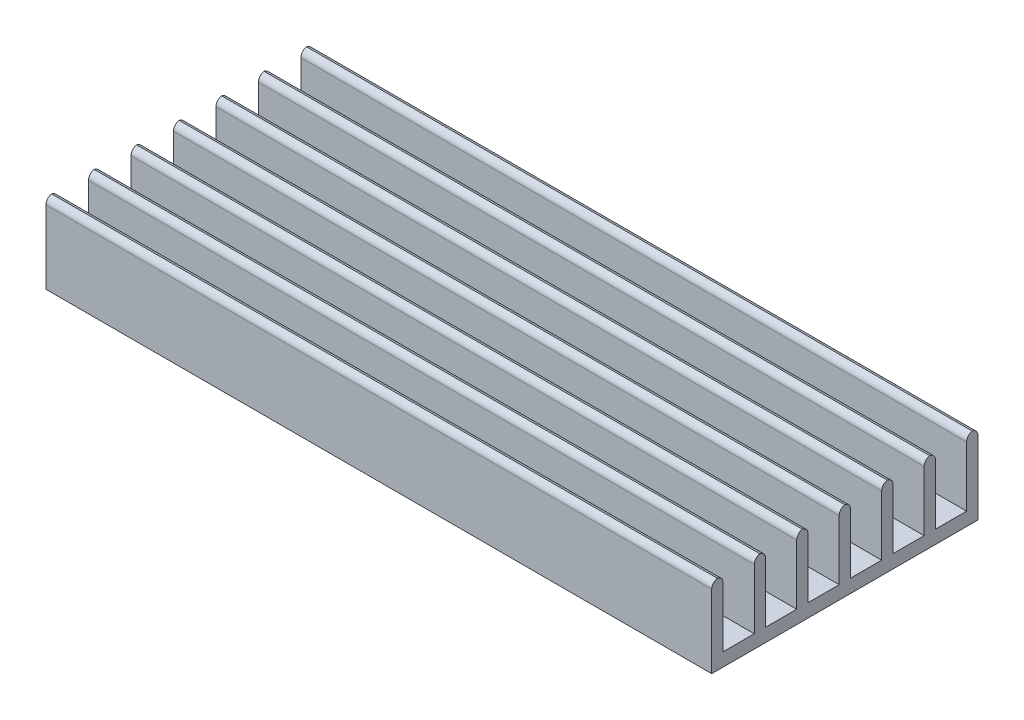
ISO-10303-21;
HEADER;
FILE_DESCRIPTION(('STEP AP214'),'2;1');
FILE_NAME('part.step','',(''),(''),'','','');
FILE_SCHEMA(('AUTOMOTIVE_DESIGN { 1 0 10303 214 1 1 1 1 }'));
ENDSEC;
DATA;
#1=APPLICATION_CONTEXT('core data for automotive mechanical design processes');
#2=APPLICATION_PROTOCOL_DEFINITION('international standard','automotive_design',2000,#1);
#3=PRODUCT_CONTEXT('',#1,'mechanical');
#4=PRODUCT('Part','Part','',(#3));
#5=PRODUCT_RELATED_PRODUCT_CATEGORY('part','',(#4));
#6=PRODUCT_DEFINITION_FORMATION('','',#4);
#7=PRODUCT_DEFINITION_CONTEXT('part definition',#1,'design');
#8=PRODUCT_DEFINITION('design','',#6,#7);
#9=PRODUCT_DEFINITION_SHAPE('','',#8);
#10=(LENGTH_UNIT() NAMED_UNIT(*) SI_UNIT(.MILLI.,.METRE.));
#11=(NAMED_UNIT(*) PLANE_ANGLE_UNIT() SI_UNIT($,.RADIAN.));
#12=(NAMED_UNIT(*) SI_UNIT($,.STERADIAN.) SOLID_ANGLE_UNIT());
#13=UNCERTAINTY_MEASURE_WITH_UNIT(LENGTH_MEASURE(1.E-05),#10,'distance_accuracy_value','');
#14=(GEOMETRIC_REPRESENTATION_CONTEXT(3) GLOBAL_UNCERTAINTY_ASSIGNED_CONTEXT((#13)) GLOBAL_UNIT_ASSIGNED_CONTEXT((#10,
#11,#12)) REPRESENTATION_CONTEXT('',''));
#15=CARTESIAN_POINT('',(0.,0.,0.));
#16=DIRECTION('',(0.,0.,1.));
#17=DIRECTION('',(1.,0.,0.));
#18=AXIS2_PLACEMENT_3D('',#15,#16,#17);
#19=CARTESIAN_POINT('',(25.,6.,-10.));
#20=DIRECTION('',(-1.,0.,0.));
#21=DIRECTION('',(0.,0.,1.));
#22=AXIS2_PLACEMENT_3D('',#19,#20,#21);
#23=PLANE('',#22);
#24=CARTESIAN_POINT('',(25.,5.5,6.455));
#25=DIRECTION('',(-1.,0.,0.));
#26=DIRECTION('',(0.,0.,1.));
#27=AXIS2_PLACEMENT_3D('',#24,#25,#26);
#28=CIRCLE('',#27,0.5);
#29=CARTESIAN_POINT('',(25.,5.5,5.955));
#30=VERTEX_POINT('',#29);
#31=CARTESIAN_POINT('',(25.,5.99434299833213,6.38));
#32=VERTEX_POINT('',#31);
#33=EDGE_CURVE('E533',#30,#32,#28,.F.);
#34=ORIENTED_EDGE('',*,*,#33,.T.);
#35=CARTESIAN_POINT('',(25.,5.5,6.305));
#36=DIRECTION('',(-1.,0.,0.));
#37=DIRECTION('',(0.,0.,1.));
#38=AXIS2_PLACEMENT_3D('',#35,#36,#37);
#39=CIRCLE('',#38,0.5);
#40=CARTESIAN_POINT('',(25.,5.5,6.805));
#41=VERTEX_POINT('',#40);
#42=EDGE_CURVE('E536',#32,#41,#39,.F.);
#43=ORIENTED_EDGE('',*,*,#42,.T.);
#44=DIRECTION('',(0.,1.,0.));
#45=VECTOR('',#44,1.);
#46=CARTESIAN_POINT('',(25.,1.,6.805));
#47=LINE('',#46,#45);
#48=CARTESIAN_POINT('',(25.,1.,6.805));
#49=VERTEX_POINT('',#48);
#50=EDGE_CURVE('E459',#49,#41,#47,.T.);
#51=ORIENTED_EDGE('',*,*,#50,.F.);
#52=DIRECTION('',(0.,0.,-1.));
#53=VECTOR('',#52,1.);
#54=CARTESIAN_POINT('',(25.,1.,0.));
#55=LINE('',#54,#53);
#56=CARTESIAN_POINT('',(25.,1.,9.145));
#57=VERTEX_POINT('',#56);
#58=EDGE_CURVE('E449',#57,#49,#55,.T.);
#59=ORIENTED_EDGE('',*,*,#58,.F.);
#60=DIRECTION('',(0.,1.,0.));
#61=VECTOR('',#60,1.);
#62=CARTESIAN_POINT('',(25.,1.,9.145));
#63=LINE('',#62,#61);
#64=CARTESIAN_POINT('',(25.,5.5,9.145));
#65=VERTEX_POINT('',#64);
#66=EDGE_CURVE('E463',#57,#65,#63,.T.);
#67=ORIENTED_EDGE('',*,*,#66,.T.);
#68=CARTESIAN_POINT('',(25.,5.5,9.645));
#69=DIRECTION('',(-1.,0.,0.));
#70=DIRECTION('',(0.,0.,1.));
#71=AXIS2_PLACEMENT_3D('',#68,#69,#70);
#72=CIRCLE('',#71,0.5);
#73=CARTESIAN_POINT('',(25.,5.99471582752121,9.5725));
#74=VERTEX_POINT('',#73);
#75=EDGE_CURVE('E506',#65,#74,#72,.F.);
#76=ORIENTED_EDGE('',*,*,#75,.T.);
#77=CARTESIAN_POINT('',(25.,5.5,9.5));
#78=DIRECTION('',(-1.,0.,0.));
#79=DIRECTION('',(0.,0.,1.));
#80=AXIS2_PLACEMENT_3D('',#77,#78,#79);
#81=CIRCLE('',#80,0.5);
#82=CARTESIAN_POINT('',(25.,5.5,10.));
#83=VERTEX_POINT('',#82);
#84=EDGE_CURVE('E503',#74,#83,#81,.F.);
#85=ORIENTED_EDGE('',*,*,#84,.T.);
#86=DIRECTION('',(0.,-1.,0.));
#87=VECTOR('',#86,1.);
#88=CARTESIAN_POINT('',(25.,6.,10.));
#89=LINE('',#88,#87);
#90=CARTESIAN_POINT('',(25.,0.,10.));
#91=VERTEX_POINT('',#90);
#92=EDGE_CURVE('E485',#83,#91,#89,.T.);
#93=ORIENTED_EDGE('',*,*,#92,.T.);
#94=DIRECTION('',(0.,0.,-1.));
#95=VECTOR('',#94,1.);
#96=CARTESIAN_POINT('',(25.,0.,-10.));
#97=LINE('',#96,#95);
#98=CARTESIAN_POINT('',(25.,0.,-10.));
#99=VERTEX_POINT('',#98);
#100=EDGE_CURVE('E310',#91,#99,#97,.T.);
#101=ORIENTED_EDGE('',*,*,#100,.T.);
#102=DIRECTION('',(0.,-1.,0.));
#103=VECTOR('',#102,1.);
#104=CARTESIAN_POINT('',(25.,6.,-10.));
#105=LINE('',#104,#103);
#106=CARTESIAN_POINT('',(25.,5.5,-10.));
#107=VERTEX_POINT('',#106);
#108=EDGE_CURVE('E494',#107,#99,#105,.T.);
#109=ORIENTED_EDGE('',*,*,#108,.F.);
#110=CARTESIAN_POINT('',(25.,5.5,-9.5));
#111=DIRECTION('',(-1.,0.,0.));
#112=DIRECTION('',(0.,0.,1.));
#113=AXIS2_PLACEMENT_3D('',#110,#111,#112);
#114=CIRCLE('',#113,0.5);
#115=CARTESIAN_POINT('',(25.,5.99471582752121,-9.5725));
#116=VERTEX_POINT('',#115);
#117=EDGE_CURVE('E497',#107,#116,#114,.F.);
#118=ORIENTED_EDGE('',*,*,#117,.T.);
#119=CARTESIAN_POINT('',(25.,5.5,-9.645));
#120=DIRECTION('',(-1.,0.,0.));
#121=DIRECTION('',(0.,0.,1.));
#122=AXIS2_PLACEMENT_3D('',#119,#120,#121);
#123=CIRCLE('',#122,0.5);
#124=CARTESIAN_POINT('',(25.,5.5,-9.145));
#125=VERTEX_POINT('',#124);
#126=EDGE_CURVE('E500',#116,#125,#123,.F.);
#127=ORIENTED_EDGE('',*,*,#126,.T.);
#128=DIRECTION('',(0.,1.,0.));
#129=VECTOR('',#128,1.);
#130=CARTESIAN_POINT('',(25.,1.,-9.145));
#131=LINE('',#130,#129);
#132=CARTESIAN_POINT('',(25.,1.,-9.145));
#133=VERTEX_POINT('',#132);
#134=EDGE_CURVE('E307',#133,#125,#131,.T.);
#135=ORIENTED_EDGE('',*,*,#134,.F.);
#136=DIRECTION('',(0.,0.,-1.));
#137=VECTOR('',#136,1.);
#138=CARTESIAN_POINT('',(25.,1.,0.));
#139=LINE('',#138,#137);
#140=CARTESIAN_POINT('',(25.,1.,-6.805));
#141=VERTEX_POINT('',#140);
#142=EDGE_CURVE('E284',#141,#133,#139,.T.);
#143=ORIENTED_EDGE('',*,*,#142,.F.);
#144=DIRECTION('',(0.,1.,0.));
#145=VECTOR('',#144,1.);
#146=CARTESIAN_POINT('',(25.,1.,-6.805));
#147=LINE('',#146,#145);
#148=CARTESIAN_POINT('',(25.,5.5,-6.805));
#149=VERTEX_POINT('',#148);
#150=EDGE_CURVE('E311',#141,#149,#147,.T.);
#151=ORIENTED_EDGE('',*,*,#150,.T.);
#152=CARTESIAN_POINT('',(25.,5.5,-6.305));
#153=DIRECTION('',(-1.,0.,0.));
#154=DIRECTION('',(0.,0.,1.));
#155=AXIS2_PLACEMENT_3D('',#152,#153,#154);
#156=CIRCLE('',#155,0.5);
#157=CARTESIAN_POINT('',(25.,5.99434299833213,-6.38));
#158=VERTEX_POINT('',#157);
#159=EDGE_CURVE('E509',#149,#158,#156,.F.);
#160=ORIENTED_EDGE('',*,*,#159,.T.);
#161=CARTESIAN_POINT('',(25.,5.5,-6.455));
#162=DIRECTION('',(-1.,0.,0.));
#163=DIRECTION('',(0.,0.,1.));
#164=AXIS2_PLACEMENT_3D('',#161,#162,#163);
#165=CIRCLE('',#164,0.5);
#166=CARTESIAN_POINT('',(25.,5.5,-5.955));
#167=VERTEX_POINT('',#166);
#168=EDGE_CURVE('E512',#158,#167,#165,.F.);
#169=ORIENTED_EDGE('',*,*,#168,.T.);
#170=DIRECTION('',(0.,1.,0.));
#171=VECTOR('',#170,1.);
#172=CARTESIAN_POINT('',(25.,1.,-5.955));
#173=LINE('',#172,#171);
#174=CARTESIAN_POINT('',(25.,1.,-5.955));
#175=VERTEX_POINT('',#174);
#176=EDGE_CURVE('E295',#175,#167,#173,.T.);
#177=ORIENTED_EDGE('',*,*,#176,.F.);
#178=DIRECTION('',(0.,0.,-1.));
#179=VECTOR('',#178,1.);
#180=CARTESIAN_POINT('',(25.,1.,0.));
#181=LINE('',#180,#179);
#182=CARTESIAN_POINT('',(25.,1.,-3.615));
#183=VERTEX_POINT('',#182);
#184=EDGE_CURVE('E329',#183,#175,#181,.T.);
#185=ORIENTED_EDGE('',*,*,#184,.F.);
#186=DIRECTION('',(0.,1.,0.));
#187=VECTOR('',#186,1.);
#188=CARTESIAN_POINT('',(25.,1.,-3.615));
#189=LINE('',#188,#187);
#190=CARTESIAN_POINT('',(25.,5.5,-3.615));
#191=VERTEX_POINT('',#190);
#192=EDGE_CURVE('E337',#183,#191,#189,.T.);
#193=ORIENTED_EDGE('',*,*,#192,.T.);
#194=CARTESIAN_POINT('',(25.,5.5,-3.115));
#195=DIRECTION('',(-1.,0.,0.));
#196=DIRECTION('',(0.,0.,1.));
#197=AXIS2_PLACEMENT_3D('',#194,#195,#196);
#198=CIRCLE('',#197,0.5);
#199=CARTESIAN_POINT('',(25.,5.99434299833213,-3.19));
#200=VERTEX_POINT('',#199);
#201=EDGE_CURVE('E515',#191,#200,#198,.F.);
#202=ORIENTED_EDGE('',*,*,#201,.T.);
#203=CARTESIAN_POINT('',(25.,5.5,-3.265));
#204=DIRECTION('',(-1.,0.,0.));
#205=DIRECTION('',(0.,0.,1.));
#206=AXIS2_PLACEMENT_3D('',#203,#204,#205);
#207=CIRCLE('',#206,0.5);
#208=CARTESIAN_POINT('',(25.,5.5,-2.765));
#209=VERTEX_POINT('',#208);
#210=EDGE_CURVE('E518',#200,#209,#207,.F.);
#211=ORIENTED_EDGE('',*,*,#210,.T.);
#212=DIRECTION('',(0.,1.,0.));
#213=VECTOR('',#212,1.);
#214=CARTESIAN_POINT('',(25.,1.,-2.765));
#215=LINE('',#214,#213);
#216=CARTESIAN_POINT('',(25.,1.,-2.765));
#217=VERTEX_POINT('',#216);
#218=EDGE_CURVE('E321',#217,#209,#215,.T.);
#219=ORIENTED_EDGE('',*,*,#218,.F.);
#220=DIRECTION('',(0.,0.,-1.));
#221=VECTOR('',#220,1.);
#222=CARTESIAN_POINT('',(25.,1.,0.));
#223=LINE('',#222,#221);
#224=CARTESIAN_POINT('',(25.,1.,-0.425));
#225=VERTEX_POINT('',#224);
#226=EDGE_CURVE('E360',#225,#217,#223,.T.);
#227=ORIENTED_EDGE('',*,*,#226,.F.);
#228=DIRECTION('',(0.,1.,0.));
#229=VECTOR('',#228,1.);
#230=CARTESIAN_POINT('',(25.,1.,-0.425));
#231=LINE('',#230,#229);
#232=CARTESIAN_POINT('',(25.,5.5,-0.425));
#233=VERTEX_POINT('',#232);
#234=EDGE_CURVE('E368',#225,#233,#231,.T.);
#235=ORIENTED_EDGE('',*,*,#234,.T.);
#236=CARTESIAN_POINT('',(25.,5.5,0.075));
#237=DIRECTION('',(-1.,0.,0.));
#238=DIRECTION('',(0.,0.,1.));
#239=AXIS2_PLACEMENT_3D('',#236,#237,#238);
#240=CIRCLE('',#239,0.5);
#241=CARTESIAN_POINT('',(25.,5.99434299833213,0.));
#242=VERTEX_POINT('',#241);
#243=EDGE_CURVE('E521',#233,#242,#240,.F.);
#244=ORIENTED_EDGE('',*,*,#243,.T.);
#245=CARTESIAN_POINT('',(25.,5.5,-0.075));
#246=DIRECTION('',(-1.,0.,0.));
#247=DIRECTION('',(0.,0.,1.));
#248=AXIS2_PLACEMENT_3D('',#245,#246,#247);
#249=CIRCLE('',#248,0.5);
#250=CARTESIAN_POINT('',(25.,5.5,0.425));
#251=VERTEX_POINT('',#250);
#252=EDGE_CURVE('E524',#242,#251,#249,.F.);
#253=ORIENTED_EDGE('',*,*,#252,.T.);
#254=DIRECTION('',(0.,1.,0.));
#255=VECTOR('',#254,1.);
#256=CARTESIAN_POINT('',(25.,1.,0.425));
#257=LINE('',#256,#255);
#258=CARTESIAN_POINT('',(25.,1.,0.425));
#259=VERTEX_POINT('',#258);
#260=EDGE_CURVE('E399',#259,#251,#257,.T.);
#261=ORIENTED_EDGE('',*,*,#260,.F.);
#262=DIRECTION('',(0.,0.,-1.));
#263=VECTOR('',#262,1.);
#264=CARTESIAN_POINT('',(25.,1.,0.));
#265=LINE('',#264,#263);
#266=CARTESIAN_POINT('',(25.,1.,2.765));
#267=VERTEX_POINT('',#266);
#268=EDGE_CURVE('E388',#267,#259,#265,.T.);
#269=ORIENTED_EDGE('',*,*,#268,.F.);
#270=DIRECTION('',(0.,1.,0.));
#271=VECTOR('',#270,1.);
#272=CARTESIAN_POINT('',(25.,1.,2.765));
#273=LINE('',#272,#271);
#274=CARTESIAN_POINT('',(25.,5.5,2.765));
#275=VERTEX_POINT('',#274);
#276=EDGE_CURVE('E403',#267,#275,#273,.T.);
#277=ORIENTED_EDGE('',*,*,#276,.T.);
#278=CARTESIAN_POINT('',(25.,5.5,3.265));
#279=DIRECTION('',(-1.,0.,0.));
#280=DIRECTION('',(0.,0.,1.));
#281=AXIS2_PLACEMENT_3D('',#278,#279,#280);
#282=CIRCLE('',#281,0.5);
#283=CARTESIAN_POINT('',(25.,5.99434299833213,3.19));
#284=VERTEX_POINT('',#283);
#285=EDGE_CURVE('E527',#275,#284,#282,.F.);
#286=ORIENTED_EDGE('',*,*,#285,.T.);
#287=CARTESIAN_POINT('',(25.,5.5,3.115));
#288=DIRECTION('',(-1.,0.,0.));
#289=DIRECTION('',(0.,0.,1.));
#290=AXIS2_PLACEMENT_3D('',#287,#288,#289);
#291=CIRCLE('',#290,0.5);
#292=CARTESIAN_POINT('',(25.,5.5,3.615));
#293=VERTEX_POINT('',#292);
#294=EDGE_CURVE('E530',#284,#293,#291,.F.);
#295=ORIENTED_EDGE('',*,*,#294,.T.);
#296=DIRECTION('',(0.,1.,0.));
#297=VECTOR('',#296,1.);
#298=CARTESIAN_POINT('',(25.,1.,3.615));
#299=LINE('',#298,#297);
#300=CARTESIAN_POINT('',(25.,1.,3.615));
#301=VERTEX_POINT('',#300);
#302=EDGE_CURVE('E429',#301,#293,#299,.T.);
#303=ORIENTED_EDGE('',*,*,#302,.F.);
#304=DIRECTION('',(0.,0.,-1.));
#305=VECTOR('',#304,1.);
#306=CARTESIAN_POINT('',(25.,1.,0.));
#307=LINE('',#306,#305);
#308=CARTESIAN_POINT('',(25.,1.,5.955));
#309=VERTEX_POINT('',#308);
#310=EDGE_CURVE('E419',#309,#301,#307,.T.);
#311=ORIENTED_EDGE('',*,*,#310,.F.);
#312=DIRECTION('',(0.,1.,0.));
#313=VECTOR('',#312,1.);
#314=CARTESIAN_POINT('',(25.,1.,5.955));
#315=LINE('',#314,#313);
#316=EDGE_CURVE('E433',#309,#30,#315,.T.);
#317=ORIENTED_EDGE('',*,*,#316,.T.);
#318=EDGE_LOOP('',(#34,#43,#51,#59,#67,#76,#85,#93,#101,#109,#118,#127,#135,#143,#151,#160,#169,
#177,#185,#193,#202,#211,#219,#227,#235,#244,#253,#261,#269,#277,#286,#295,#303,#311,#317));
#319=FACE_BOUND('',#318,.T.);
#320=ADVANCED_FACE('F45',(#319),#23,.F.);
#321=CARTESIAN_POINT('',(-25.,6.,-10.));
#322=DIRECTION('',(1.,0.,0.));
#323=DIRECTION('',(0.,0.,-1.));
#324=AXIS2_PLACEMENT_3D('',#321,#322,#323);
#325=PLANE('',#324);
#326=DIRECTION('',(0.,1.,0.));
#327=VECTOR('',#326,1.);
#328=CARTESIAN_POINT('',(-25.,1.,6.805));
#329=LINE('',#328,#327);
#330=CARTESIAN_POINT('',(-25.,1.,6.805));
#331=VERTEX_POINT('',#330);
#332=CARTESIAN_POINT('',(-25.,5.5,6.805));
#333=VERTEX_POINT('',#332);
#334=EDGE_CURVE('E415',#331,#333,#329,.T.);
#335=ORIENTED_EDGE('',*,*,#334,.T.);
#336=CARTESIAN_POINT('',(-25.,5.5,6.305));
#337=DIRECTION('',(1.,0.,0.));
#338=DIRECTION('',(0.,0.,-1.));
#339=AXIS2_PLACEMENT_3D('',#336,#337,#338);
#340=CIRCLE('',#339,0.5);
#341=CARTESIAN_POINT('',(-25.,5.99434299833213,6.38));
#342=VERTEX_POINT('',#341);
#343=EDGE_CURVE('E63',#333,#342,#340,.F.);
#344=ORIENTED_EDGE('',*,*,#343,.T.);
#345=CARTESIAN_POINT('',(-25.,5.5,6.455));
#346=DIRECTION('',(1.,0.,0.));
#347=DIRECTION('',(0.,0.,-1.));
#348=AXIS2_PLACEMENT_3D('',#345,#346,#347);
#349=CIRCLE('',#348,0.5);
#350=CARTESIAN_POINT('',(-25.,5.5,5.955));
#351=VERTEX_POINT('',#350);
#352=EDGE_CURVE('E578',#342,#351,#349,.F.);
#353=ORIENTED_EDGE('',*,*,#352,.T.);
#354=DIRECTION('',(0.,1.,0.));
#355=VECTOR('',#354,1.);
#356=CARTESIAN_POINT('',(-25.,1.,5.955));
#357=LINE('',#356,#355);
#358=CARTESIAN_POINT('',(-25.,1.,5.955));
#359=VERTEX_POINT('',#358);
#360=EDGE_CURVE('E426',#359,#351,#357,.T.);
#361=ORIENTED_EDGE('',*,*,#360,.F.);
#362=DIRECTION('',(0.,0.,1.));
#363=VECTOR('',#362,1.);
#364=CARTESIAN_POINT('',(-25.,1.,0.));
#365=LINE('',#364,#363);
#366=CARTESIAN_POINT('',(-25.,1.,3.615));
#367=VERTEX_POINT('',#366);
#368=EDGE_CURVE('E410',#367,#359,#365,.T.);
#369=ORIENTED_EDGE('',*,*,#368,.F.);
#370=DIRECTION('',(0.,1.,0.));
#371=VECTOR('',#370,1.);
#372=CARTESIAN_POINT('',(-25.,1.,3.615));
#373=LINE('',#372,#371);
#374=CARTESIAN_POINT('',(-25.,5.5,3.615));
#375=VERTEX_POINT('',#374);
#376=EDGE_CURVE('E384',#367,#375,#373,.T.);
#377=ORIENTED_EDGE('',*,*,#376,.T.);
#378=CARTESIAN_POINT('',(-25.,5.5,3.115));
#379=DIRECTION('',(1.,0.,0.));
#380=DIRECTION('',(0.,0.,-1.));
#381=AXIS2_PLACEMENT_3D('',#378,#379,#380);
#382=CIRCLE('',#381,0.5);
#383=CARTESIAN_POINT('',(-25.,5.99434299833213,3.19));
#384=VERTEX_POINT('',#383);
#385=EDGE_CURVE('E70',#375,#384,#382,.F.);
#386=ORIENTED_EDGE('',*,*,#385,.T.);
#387=CARTESIAN_POINT('',(-25.,5.5,3.265));
#388=DIRECTION('',(1.,0.,0.));
#389=DIRECTION('',(0.,0.,-1.));
#390=AXIS2_PLACEMENT_3D('',#387,#388,#389);
#391=CIRCLE('',#390,0.5);
#392=CARTESIAN_POINT('',(-25.,5.5,2.765));
#393=VERTEX_POINT('',#392);
#394=EDGE_CURVE('E573',#384,#393,#391,.F.);
#395=ORIENTED_EDGE('',*,*,#394,.T.);
#396=DIRECTION('',(0.,1.,0.));
#397=VECTOR('',#396,1.);
#398=CARTESIAN_POINT('',(-25.,1.,2.765));
#399=LINE('',#398,#397);
#400=CARTESIAN_POINT('',(-25.,1.,2.765));
#401=VERTEX_POINT('',#400);
#402=EDGE_CURVE('E395',#401,#393,#399,.T.);
#403=ORIENTED_EDGE('',*,*,#402,.F.);
#404=DIRECTION('',(0.,0.,1.));
#405=VECTOR('',#404,1.);
#406=CARTESIAN_POINT('',(-25.,1.,0.));
#407=LINE('',#406,#405);
#408=CARTESIAN_POINT('',(-25.,1.,0.425));
#409=VERTEX_POINT('',#408);
#410=EDGE_CURVE('E379',#409,#401,#407,.T.);
#411=ORIENTED_EDGE('',*,*,#410,.F.);
#412=DIRECTION('',(0.,1.,0.));
#413=VECTOR('',#412,1.);
#414=CARTESIAN_POINT('',(-25.,1.,0.425));
#415=LINE('',#414,#413);
#416=CARTESIAN_POINT('',(-25.,5.5,0.425));
#417=VERTEX_POINT('',#416);
#418=EDGE_CURVE('E352',#409,#417,#415,.T.);
#419=ORIENTED_EDGE('',*,*,#418,.T.);
#420=CARTESIAN_POINT('',(-25.,5.5,-0.075));
#421=DIRECTION('',(1.,0.,0.));
#422=DIRECTION('',(0.,0.,-1.));
#423=AXIS2_PLACEMENT_3D('',#420,#421,#422);
#424=CIRCLE('',#423,0.5);
#425=CARTESIAN_POINT('',(-25.,5.99434299833213,0.));
#426=VERTEX_POINT('',#425);
#427=EDGE_CURVE('E570',#417,#426,#424,.F.);
#428=ORIENTED_EDGE('',*,*,#427,.T.);
#429=CARTESIAN_POINT('',(-25.,5.5,0.075));
#430=DIRECTION('',(1.,0.,0.));
#431=DIRECTION('',(0.,0.,-1.));
#432=AXIS2_PLACEMENT_3D('',#429,#430,#431);
#433=CIRCLE('',#432,0.5);
#434=CARTESIAN_POINT('',(-25.,5.5,-0.425));
#435=VERTEX_POINT('',#434);
#436=EDGE_CURVE('E567',#426,#435,#433,.F.);
#437=ORIENTED_EDGE('',*,*,#436,.T.);
#438=DIRECTION('',(0.,1.,0.));
#439=VECTOR('',#438,1.);
#440=CARTESIAN_POINT('',(-25.,1.,-0.425));
#441=LINE('',#440,#439);
#442=CARTESIAN_POINT('',(-25.,1.,-0.425));
#443=VERTEX_POINT('',#442);
#444=EDGE_CURVE('E372',#443,#435,#441,.T.);
#445=ORIENTED_EDGE('',*,*,#444,.F.);
#446=DIRECTION('',(0.,0.,1.));
#447=VECTOR('',#446,1.);
#448=CARTESIAN_POINT('',(-25.,1.,0.));
#449=LINE('',#448,#447);
#450=CARTESIAN_POINT('',(-25.,1.,-2.765));
#451=VERTEX_POINT('',#450);
#452=EDGE_CURVE('E351',#451,#443,#449,.T.);
#453=ORIENTED_EDGE('',*,*,#452,.F.);
#454=DIRECTION('',(0.,1.,0.));
#455=VECTOR('',#454,1.);
#456=CARTESIAN_POINT('',(-25.,1.,-2.765));
#457=LINE('',#456,#455);
#458=CARTESIAN_POINT('',(-25.,5.5,-2.765));
#459=VERTEX_POINT('',#458);
#460=EDGE_CURVE('E364',#451,#459,#457,.T.);
#461=ORIENTED_EDGE('',*,*,#460,.T.);
#462=CARTESIAN_POINT('',(-25.,5.5,-3.265));
#463=DIRECTION('',(1.,0.,0.));
#464=DIRECTION('',(0.,0.,-1.));
#465=AXIS2_PLACEMENT_3D('',#462,#463,#464);
#466=CIRCLE('',#465,0.5);
#467=CARTESIAN_POINT('',(-25.,5.99434299833213,-3.19));
#468=VERTEX_POINT('',#467);
#469=EDGE_CURVE('E564',#459,#468,#466,.F.);
#470=ORIENTED_EDGE('',*,*,#469,.T.);
#471=CARTESIAN_POINT('',(-25.,5.5,-3.115));
#472=DIRECTION('',(1.,0.,0.));
#473=DIRECTION('',(0.,0.,-1.));
#474=AXIS2_PLACEMENT_3D('',#471,#472,#473);
#475=CIRCLE('',#474,0.5);
#476=CARTESIAN_POINT('',(-25.,5.5,-3.615));
#477=VERTEX_POINT('',#476);
#478=EDGE_CURVE('E561',#468,#477,#475,.F.);
#479=ORIENTED_EDGE('',*,*,#478,.T.);
#480=DIRECTION('',(0.,1.,0.));
#481=VECTOR('',#480,1.);
#482=CARTESIAN_POINT('',(-25.,1.,-3.615));
#483=LINE('',#482,#481);
#484=CARTESIAN_POINT('',(-25.,1.,-3.615));
#485=VERTEX_POINT('',#484);
#486=EDGE_CURVE('E341',#485,#477,#483,.T.);
#487=ORIENTED_EDGE('',*,*,#486,.F.);
#488=DIRECTION('',(0.,0.,1.));
#489=VECTOR('',#488,1.);
#490=CARTESIAN_POINT('',(-25.,1.,0.));
#491=LINE('',#490,#489);
#492=CARTESIAN_POINT('',(-25.,1.,-5.955));
#493=VERTEX_POINT('',#492);
#494=EDGE_CURVE('E320',#493,#485,#491,.T.);
#495=ORIENTED_EDGE('',*,*,#494,.F.);
#496=DIRECTION('',(0.,1.,0.));
#497=VECTOR('',#496,1.);
#498=CARTESIAN_POINT('',(-25.,1.,-5.955));
#499=LINE('',#498,#497);
#500=CARTESIAN_POINT('',(-25.,5.5,-5.955));
#501=VERTEX_POINT('',#500);
#502=EDGE_CURVE('E333',#493,#501,#499,.T.);
#503=ORIENTED_EDGE('',*,*,#502,.T.);
#504=CARTESIAN_POINT('',(-25.,5.5,-6.455));
#505=DIRECTION('',(1.,0.,0.));
#506=DIRECTION('',(0.,0.,-1.));
#507=AXIS2_PLACEMENT_3D('',#504,#505,#506);
#508=CIRCLE('',#507,0.5);
#509=CARTESIAN_POINT('',(-25.,5.99434299833213,-6.38));
#510=VERTEX_POINT('',#509);
#511=EDGE_CURVE('E558',#501,#510,#508,.F.);
#512=ORIENTED_EDGE('',*,*,#511,.T.);
#513=CARTESIAN_POINT('',(-25.,5.5,-6.305));
#514=DIRECTION('',(1.,0.,0.));
#515=DIRECTION('',(0.,0.,-1.));
#516=AXIS2_PLACEMENT_3D('',#513,#514,#515);
#517=CIRCLE('',#516,0.5);
#518=CARTESIAN_POINT('',(-25.,5.5,-6.805));
#519=VERTEX_POINT('',#518);
#520=EDGE_CURVE('E555',#510,#519,#517,.F.);
#521=ORIENTED_EDGE('',*,*,#520,.T.);
#522=DIRECTION('',(0.,1.,0.));
#523=VECTOR('',#522,1.);
#524=CARTESIAN_POINT('',(-25.,1.,-6.805));
#525=LINE('',#524,#523);
#526=CARTESIAN_POINT('',(-25.,1.,-6.805));
#527=VERTEX_POINT('',#526);
#528=EDGE_CURVE('E283',#527,#519,#525,.T.);
#529=ORIENTED_EDGE('',*,*,#528,.F.);
#530=DIRECTION('',(0.,0.,1.));
#531=VECTOR('',#530,1.);
#532=CARTESIAN_POINT('',(-25.,1.,0.));
#533=LINE('',#532,#531);
#534=CARTESIAN_POINT('',(-25.,1.,-9.145));
#535=VERTEX_POINT('',#534);
#536=EDGE_CURVE('E290',#535,#527,#533,.T.);
#537=ORIENTED_EDGE('',*,*,#536,.F.);
#538=DIRECTION('',(0.,1.,0.));
#539=VECTOR('',#538,1.);
#540=CARTESIAN_POINT('',(-25.,1.,-9.145));
#541=LINE('',#540,#539);
#542=CARTESIAN_POINT('',(-25.,5.5,-9.145));
#543=VERTEX_POINT('',#542);
#544=EDGE_CURVE('E273',#535,#543,#541,.T.);
#545=ORIENTED_EDGE('',*,*,#544,.T.);
#546=CARTESIAN_POINT('',(-25.,5.5,-9.645));
#547=DIRECTION('',(1.,0.,0.));
#548=DIRECTION('',(0.,0.,-1.));
#549=AXIS2_PLACEMENT_3D('',#546,#547,#548);
#550=CIRCLE('',#549,0.5);
#551=CARTESIAN_POINT('',(-25.,5.99471582752121,-9.5725));
#552=VERTEX_POINT('',#551);
#553=EDGE_CURVE('E546',#543,#552,#550,.F.);
#554=ORIENTED_EDGE('',*,*,#553,.T.);
#555=CARTESIAN_POINT('',(-25.,5.5,-9.5));
#556=DIRECTION('',(1.,0.,0.));
#557=DIRECTION('',(0.,0.,-1.));
#558=AXIS2_PLACEMENT_3D('',#555,#556,#557);
#559=CIRCLE('',#558,0.5);
#560=CARTESIAN_POINT('',(-25.,5.5,-10.));
#561=VERTEX_POINT('',#560);
#562=EDGE_CURVE('E543',#552,#561,#559,.F.);
#563=ORIENTED_EDGE('',*,*,#562,.T.);
#564=DIRECTION('',(0.,-1.,0.));
#565=VECTOR('',#564,1.);
#566=CARTESIAN_POINT('',(-25.,6.,-10.));
#567=LINE('',#566,#565);
#568=CARTESIAN_POINT('',(-25.,0.,-10.));
#569=VERTEX_POINT('',#568);
#570=EDGE_CURVE('E491',#561,#569,#567,.T.);
#571=ORIENTED_EDGE('',*,*,#570,.T.);
#572=DIRECTION('',(0.,0.,1.));
#573=VECTOR('',#572,1.);
#574=CARTESIAN_POINT('',(-25.,0.,-10.));
#575=LINE('',#574,#573);
#576=CARTESIAN_POINT('',(-25.,0.,10.));
#577=VERTEX_POINT('',#576);
#578=EDGE_CURVE('E477',#569,#577,#575,.T.);
#579=ORIENTED_EDGE('',*,*,#578,.T.);
#580=DIRECTION('',(0.,-1.,0.));
#581=VECTOR('',#580,1.);
#582=CARTESIAN_POINT('',(-25.,6.,10.));
#583=LINE('',#582,#581);
#584=CARTESIAN_POINT('',(-25.,5.5,10.));
#585=VERTEX_POINT('',#584);
#586=EDGE_CURVE('E488',#585,#577,#583,.T.);
#587=ORIENTED_EDGE('',*,*,#586,.F.);
#588=CARTESIAN_POINT('',(-25.,5.5,9.5));
#589=DIRECTION('',(1.,0.,0.));
#590=DIRECTION('',(0.,0.,-1.));
#591=AXIS2_PLACEMENT_3D('',#588,#589,#590);
#592=CIRCLE('',#591,0.5);
#593=CARTESIAN_POINT('',(-25.,5.99471582752121,9.5725));
#594=VERTEX_POINT('',#593);
#595=EDGE_CURVE('E549',#585,#594,#592,.F.);
#596=ORIENTED_EDGE('',*,*,#595,.T.);
#597=CARTESIAN_POINT('',(-25.,5.5,9.645));
#598=DIRECTION('',(1.,0.,0.));
#599=DIRECTION('',(0.,0.,-1.));
#600=AXIS2_PLACEMENT_3D('',#597,#598,#599);
#601=CIRCLE('',#600,0.5);
#602=CARTESIAN_POINT('',(-25.,5.5,9.145));
#603=VERTEX_POINT('',#602);
#604=EDGE_CURVE('E552',#594,#603,#601,.F.);
#605=ORIENTED_EDGE('',*,*,#604,.T.);
#606=DIRECTION('',(0.,1.,0.));
#607=VECTOR('',#606,1.);
#608=CARTESIAN_POINT('',(-25.,1.,9.145));
#609=LINE('',#608,#607);
#610=CARTESIAN_POINT('',(-25.,1.,9.145));
#611=VERTEX_POINT('',#610);
#612=EDGE_CURVE('E456',#611,#603,#609,.T.);
#613=ORIENTED_EDGE('',*,*,#612,.F.);
#614=DIRECTION('',(0.,0.,1.));
#615=VECTOR('',#614,1.);
#616=CARTESIAN_POINT('',(-25.,1.,0.));
#617=LINE('',#616,#615);
#618=EDGE_CURVE('E440',#331,#611,#617,.T.);
#619=ORIENTED_EDGE('',*,*,#618,.F.);
#620=EDGE_LOOP('',(#335,#344,#353,#361,#369,#377,#386,#395,#403,#411,#419,#428,#437,#445,#453,
#461,#470,#479,#487,#495,#503,#512,#521,#529,#537,#545,#554,#563,#571,#579,#587,#596,#605,#613,#619));
#621=FACE_BOUND('',#620,.T.);
#622=ADVANCED_FACE('F297',(#621),#325,.F.);
#623=CARTESIAN_POINT('',(-25.,6.,-10.));
#624=DIRECTION('',(0.,0.,1.));
#625=DIRECTION('',(1.,0.,0.));
#626=AXIS2_PLACEMENT_3D('',#623,#624,#625);
#627=PLANE('',#626);
#628=ORIENTED_EDGE('',*,*,#570,.F.);
#629=DIRECTION('',(-1.,0.,0.));
#630=VECTOR('',#629,1.);
#631=CARTESIAN_POINT('',(25.,5.5,-10.));
#632=LINE('',#631,#630);
#633=EDGE_CURVE('E11',#561,#107,#632,.F.);
#634=ORIENTED_EDGE('',*,*,#633,.T.);
#635=ORIENTED_EDGE('',*,*,#108,.T.);
#636=DIRECTION('',(-1.,0.,0.));
#637=VECTOR('',#636,1.);
#638=CARTESIAN_POINT('',(-25.,0.,-10.));
#639=LINE('',#638,#637);
#640=EDGE_CURVE('E473',#99,#569,#639,.T.);
#641=ORIENTED_EDGE('',*,*,#640,.T.);
#642=EDGE_LOOP('',(#628,#634,#635,#641));
#643=FACE_BOUND('',#642,.T.);
#644=ADVANCED_FACE('F693',(#643),#627,.F.);
#645=CARTESIAN_POINT('',(-25.,6.,10.));
#646=DIRECTION('',(0.,0.,-1.));
#647=DIRECTION('',(-1.,0.,0.));
#648=AXIS2_PLACEMENT_3D('',#645,#646,#647);
#649=PLANE('',#648);
#650=ORIENTED_EDGE('',*,*,#92,.F.);
#651=DIRECTION('',(1.,0.,0.));
#652=VECTOR('',#651,1.);
#653=CARTESIAN_POINT('',(-25.,5.5,10.));
#654=LINE('',#653,#652);
#655=EDGE_CURVE('E55',#83,#585,#654,.F.);
#656=ORIENTED_EDGE('',*,*,#655,.T.);
#657=ORIENTED_EDGE('',*,*,#586,.T.);
#658=DIRECTION('',(1.,0.,0.));
#659=VECTOR('',#658,1.);
#660=CARTESIAN_POINT('',(-25.,0.,10.));
#661=LINE('',#660,#659);
#662=EDGE_CURVE('E481',#577,#91,#661,.T.);
#663=ORIENTED_EDGE('',*,*,#662,.T.);
#664=EDGE_LOOP('',(#650,#656,#657,#663));
#665=FACE_BOUND('',#664,.T.);
#666=ADVANCED_FACE('F1000',(#665),#649,.F.);
#667=CARTESIAN_POINT('',(0.,0.,0.));
#668=DIRECTION('',(0.,1.,0.));
#669=DIRECTION('',(0.,0.,1.));
#670=AXIS2_PLACEMENT_3D('',#667,#668,#669);
#671=PLANE('',#670);
#672=ORIENTED_EDGE('',*,*,#100,.F.);
#673=ORIENTED_EDGE('',*,*,#662,.F.);
#674=ORIENTED_EDGE('',*,*,#578,.F.);
#675=ORIENTED_EDGE('',*,*,#640,.F.);
#676=EDGE_LOOP('',(#672,#673,#674,#675));
#677=FACE_BOUND('',#676,.T.);
#678=ADVANCED_FACE('F699',(#677),#671,.F.);
#679=CARTESIAN_POINT('',(0.,1.,6.805));
#680=DIRECTION('',(0.,0.,1.));
#681=DIRECTION('',(1.,0.,0.));
#682=AXIS2_PLACEMENT_3D('',#679,#680,#681);
#683=PLANE('',#682);
#684=ORIENTED_EDGE('',*,*,#50,.T.);
#685=DIRECTION('',(1.,0.,0.));
#686=VECTOR('',#685,1.);
#687=CARTESIAN_POINT('',(0.,5.5,6.805));
#688=LINE('',#687,#686);
#689=EDGE_CURVE('E589',#41,#333,#688,.F.);
#690=ORIENTED_EDGE('',*,*,#689,.T.);
#691=ORIENTED_EDGE('',*,*,#334,.F.);
#692=DIRECTION('',(1.,0.,0.));
#693=VECTOR('',#692,1.);
#694=CARTESIAN_POINT('',(0.,1.,6.805));
#695=LINE('',#694,#693);
#696=EDGE_CURVE('E453',#331,#49,#695,.T.);
#697=ORIENTED_EDGE('',*,*,#696,.T.);
#698=EDGE_LOOP('',(#684,#690,#691,#697));
#699=FACE_BOUND('',#698,.T.);
#700=ADVANCED_FACE('F722',(#699),#683,.T.);
#701=CARTESIAN_POINT('',(0.,1.,9.145));
#702=DIRECTION('',(0.,0.,1.));
#703=DIRECTION('',(1.,0.,0.));
#704=AXIS2_PLACEMENT_3D('',#701,#702,#703);
#705=PLANE('',#704);
#706=ORIENTED_EDGE('',*,*,#612,.T.);
#707=DIRECTION('',(1.,0.,0.));
#708=VECTOR('',#707,1.);
#709=CARTESIAN_POINT('',(25.,5.5,9.145));
#710=LINE('',#709,#708);
#711=EDGE_CURVE('E585',#603,#65,#710,.T.);
#712=ORIENTED_EDGE('',*,*,#711,.T.);
#713=ORIENTED_EDGE('',*,*,#66,.F.);
#714=DIRECTION('',(1.,0.,0.));
#715=VECTOR('',#714,1.);
#716=CARTESIAN_POINT('',(0.,1.,9.145));
#717=LINE('',#716,#715);
#718=EDGE_CURVE('E444',#611,#57,#717,.T.);
#719=ORIENTED_EDGE('',*,*,#718,.F.);
#720=EDGE_LOOP('',(#706,#712,#713,#719));
#721=FACE_BOUND('',#720,.T.);
#722=ADVANCED_FACE('F716',(#721),#705,.F.);
#723=CARTESIAN_POINT('',(0.,1.,0.));
#724=DIRECTION('',(0.,1.,0.));
#725=DIRECTION('',(0.,0.,1.));
#726=AXIS2_PLACEMENT_3D('',#723,#724,#725);
#727=PLANE('',#726);
#728=ORIENTED_EDGE('',*,*,#618,.T.);
#729=ORIENTED_EDGE('',*,*,#718,.T.);
#730=ORIENTED_EDGE('',*,*,#58,.T.);
#731=ORIENTED_EDGE('',*,*,#696,.F.);
#732=EDGE_LOOP('',(#728,#729,#730,#731));
#733=FACE_BOUND('',#732,.T.);
#734=ADVANCED_FACE('F720',(#733),#727,.T.);
#735=CARTESIAN_POINT('',(0.,1.,3.615));
#736=DIRECTION('',(0.,0.,1.));
#737=DIRECTION('',(1.,0.,0.));
#738=AXIS2_PLACEMENT_3D('',#735,#736,#737);
#739=PLANE('',#738);
#740=ORIENTED_EDGE('',*,*,#302,.T.);
#741=DIRECTION('',(1.,0.,0.));
#742=VECTOR('',#741,1.);
#743=CARTESIAN_POINT('',(0.,5.5,3.615));
#744=LINE('',#743,#742);
#745=EDGE_CURVE('E596',#293,#375,#744,.F.);
#746=ORIENTED_EDGE('',*,*,#745,.T.);
#747=ORIENTED_EDGE('',*,*,#376,.F.);
#748=DIRECTION('',(1.,0.,0.));
#749=VECTOR('',#748,1.);
#750=CARTESIAN_POINT('',(0.,1.,3.615));
#751=LINE('',#750,#749);
#752=EDGE_CURVE('E423',#367,#301,#751,.T.);
#753=ORIENTED_EDGE('',*,*,#752,.T.);
#754=EDGE_LOOP('',(#740,#746,#747,#753));
#755=FACE_BOUND('',#754,.T.);
#756=ADVANCED_FACE('F742',(#755),#739,.T.);
#757=CARTESIAN_POINT('',(0.,1.,5.955));
#758=DIRECTION('',(0.,0.,1.));
#759=DIRECTION('',(1.,0.,0.));
#760=AXIS2_PLACEMENT_3D('',#757,#758,#759);
#761=PLANE('',#760);
#762=ORIENTED_EDGE('',*,*,#360,.T.);
#763=DIRECTION('',(1.,0.,0.));
#764=VECTOR('',#763,1.);
#765=CARTESIAN_POINT('',(25.,5.5,5.955));
#766=LINE('',#765,#764);
#767=EDGE_CURVE('E593',#351,#30,#766,.T.);
#768=ORIENTED_EDGE('',*,*,#767,.T.);
#769=ORIENTED_EDGE('',*,*,#316,.F.);
#770=DIRECTION('',(1.,0.,0.));
#771=VECTOR('',#770,1.);
#772=CARTESIAN_POINT('',(0.,1.,5.955));
#773=LINE('',#772,#771);
#774=EDGE_CURVE('E414',#359,#309,#773,.T.);
#775=ORIENTED_EDGE('',*,*,#774,.F.);
#776=EDGE_LOOP('',(#762,#768,#769,#775));
#777=FACE_BOUND('',#776,.T.);
#778=ADVANCED_FACE('F736',(#777),#761,.F.);
#779=CARTESIAN_POINT('',(0.,1.,0.));
#780=DIRECTION('',(0.,1.,0.));
#781=DIRECTION('',(0.,0.,1.));
#782=AXIS2_PLACEMENT_3D('',#779,#780,#781);
#783=PLANE('',#782);
#784=ORIENTED_EDGE('',*,*,#368,.T.);
#785=ORIENTED_EDGE('',*,*,#774,.T.);
#786=ORIENTED_EDGE('',*,*,#310,.T.);
#787=ORIENTED_EDGE('',*,*,#752,.F.);
#788=EDGE_LOOP('',(#784,#785,#786,#787));
#789=FACE_BOUND('',#788,.T.);
#790=ADVANCED_FACE('F740',(#789),#783,.T.);
#791=CARTESIAN_POINT('',(0.,1.,0.425));
#792=DIRECTION('',(0.,0.,1.));
#793=DIRECTION('',(1.,0.,0.));
#794=AXIS2_PLACEMENT_3D('',#791,#792,#793);
#795=PLANE('',#794);
#796=ORIENTED_EDGE('',*,*,#260,.T.);
#797=DIRECTION('',(1.,0.,0.));
#798=VECTOR('',#797,1.);
#799=CARTESIAN_POINT('',(0.,5.5,0.425));
#800=LINE('',#799,#798);
#801=EDGE_CURVE('E603',#251,#417,#800,.F.);
#802=ORIENTED_EDGE('',*,*,#801,.T.);
#803=ORIENTED_EDGE('',*,*,#418,.F.);
#804=DIRECTION('',(1.,0.,0.));
#805=VECTOR('',#804,1.);
#806=CARTESIAN_POINT('',(0.,1.,0.425));
#807=LINE('',#806,#805);
#808=EDGE_CURVE('E392',#409,#259,#807,.T.);
#809=ORIENTED_EDGE('',*,*,#808,.T.);
#810=EDGE_LOOP('',(#796,#802,#803,#809));
#811=FACE_BOUND('',#810,.T.);
#812=ADVANCED_FACE('F763',(#811),#795,.T.);
#813=CARTESIAN_POINT('',(0.,1.,2.765));
#814=DIRECTION('',(0.,0.,1.));
#815=DIRECTION('',(1.,0.,0.));
#816=AXIS2_PLACEMENT_3D('',#813,#814,#815);
#817=PLANE('',#816);
#818=ORIENTED_EDGE('',*,*,#402,.T.);
#819=DIRECTION('',(1.,0.,0.));
#820=VECTOR('',#819,1.);
#821=CARTESIAN_POINT('',(25.,5.5,2.765));
#822=LINE('',#821,#820);
#823=EDGE_CURVE('E600',#393,#275,#822,.T.);
#824=ORIENTED_EDGE('',*,*,#823,.T.);
#825=ORIENTED_EDGE('',*,*,#276,.F.);
#826=DIRECTION('',(1.,0.,0.));
#827=VECTOR('',#826,1.);
#828=CARTESIAN_POINT('',(0.,1.,2.765));
#829=LINE('',#828,#827);
#830=EDGE_CURVE('E383',#401,#267,#829,.T.);
#831=ORIENTED_EDGE('',*,*,#830,.F.);
#832=EDGE_LOOP('',(#818,#824,#825,#831));
#833=FACE_BOUND('',#832,.T.);
#834=ADVANCED_FACE('F756',(#833),#817,.F.);
#835=CARTESIAN_POINT('',(0.,1.,0.));
#836=DIRECTION('',(0.,1.,0.));
#837=DIRECTION('',(0.,0.,1.));
#838=AXIS2_PLACEMENT_3D('',#835,#836,#837);
#839=PLANE('',#838);
#840=ORIENTED_EDGE('',*,*,#410,.T.);
#841=ORIENTED_EDGE('',*,*,#830,.T.);
#842=ORIENTED_EDGE('',*,*,#268,.T.);
#843=ORIENTED_EDGE('',*,*,#808,.F.);
#844=EDGE_LOOP('',(#840,#841,#842,#843));
#845=FACE_BOUND('',#844,.T.);
#846=ADVANCED_FACE('F760',(#845),#839,.T.);
#847=CARTESIAN_POINT('',(0.,1.,-2.765));
#848=DIRECTION('',(0.,0.,1.));
#849=DIRECTION('',(1.,0.,0.));
#850=AXIS2_PLACEMENT_3D('',#847,#848,#849);
#851=PLANE('',#850);
#852=ORIENTED_EDGE('',*,*,#218,.T.);
#853=DIRECTION('',(1.,0.,0.));
#854=VECTOR('',#853,1.);
#855=CARTESIAN_POINT('',(0.,5.5,-2.765));
#856=LINE('',#855,#854);
#857=EDGE_CURVE('E610',#209,#459,#856,.F.);
#858=ORIENTED_EDGE('',*,*,#857,.T.);
#859=ORIENTED_EDGE('',*,*,#460,.F.);
#860=DIRECTION('',(1.,0.,0.));
#861=VECTOR('',#860,1.);
#862=CARTESIAN_POINT('',(0.,1.,-2.765));
#863=LINE('',#862,#861);
#864=EDGE_CURVE('E348',#451,#217,#863,.T.);
#865=ORIENTED_EDGE('',*,*,#864,.T.);
#866=EDGE_LOOP('',(#852,#858,#859,#865));
#867=FACE_BOUND('',#866,.T.);
#868=ADVANCED_FACE('F780',(#867),#851,.T.);
#869=CARTESIAN_POINT('',(0.,1.,-0.425));
#870=DIRECTION('',(0.,0.,1.));
#871=DIRECTION('',(1.,0.,0.));
#872=AXIS2_PLACEMENT_3D('',#869,#870,#871);
#873=PLANE('',#872);
#874=ORIENTED_EDGE('',*,*,#444,.T.);
#875=DIRECTION('',(1.,0.,0.));
#876=VECTOR('',#875,1.);
#877=CARTESIAN_POINT('',(25.,5.5,-0.425));
#878=LINE('',#877,#876);
#879=EDGE_CURVE('E607',#435,#233,#878,.T.);
#880=ORIENTED_EDGE('',*,*,#879,.T.);
#881=ORIENTED_EDGE('',*,*,#234,.F.);
#882=DIRECTION('',(1.,0.,0.));
#883=VECTOR('',#882,1.);
#884=CARTESIAN_POINT('',(0.,1.,-0.425));
#885=LINE('',#884,#883);
#886=EDGE_CURVE('E356',#443,#225,#885,.T.);
#887=ORIENTED_EDGE('',*,*,#886,.F.);
#888=EDGE_LOOP('',(#874,#880,#881,#887));
#889=FACE_BOUND('',#888,.T.);
#890=ADVANCED_FACE('F775',(#889),#873,.F.);
#891=CARTESIAN_POINT('',(0.,1.,0.));
#892=DIRECTION('',(0.,1.,0.));
#893=DIRECTION('',(0.,0.,1.));
#894=AXIS2_PLACEMENT_3D('',#891,#892,#893);
#895=PLANE('',#894);
#896=ORIENTED_EDGE('',*,*,#864,.F.);
#897=ORIENTED_EDGE('',*,*,#452,.T.);
#898=ORIENTED_EDGE('',*,*,#886,.T.);
#899=ORIENTED_EDGE('',*,*,#226,.T.);
#900=EDGE_LOOP('',(#896,#897,#898,#899));
#901=FACE_BOUND('',#900,.T.);
#902=ADVANCED_FACE('F778',(#901),#895,.T.);
#903=CARTESIAN_POINT('',(0.,1.,-5.955));
#904=DIRECTION('',(0.,0.,1.));
#905=DIRECTION('',(1.,0.,0.));
#906=AXIS2_PLACEMENT_3D('',#903,#904,#905);
#907=PLANE('',#906);
#908=ORIENTED_EDGE('',*,*,#176,.T.);
#909=DIRECTION('',(1.,0.,0.));
#910=VECTOR('',#909,1.);
#911=CARTESIAN_POINT('',(0.,5.5,-5.955));
#912=LINE('',#911,#910);
#913=EDGE_CURVE('E539',#167,#501,#912,.F.);
#914=ORIENTED_EDGE('',*,*,#913,.T.);
#915=ORIENTED_EDGE('',*,*,#502,.F.);
#916=DIRECTION('',(1.,0.,0.));
#917=VECTOR('',#916,1.);
#918=CARTESIAN_POINT('',(0.,1.,-5.955));
#919=LINE('',#918,#917);
#920=EDGE_CURVE('E317',#493,#175,#919,.T.);
#921=ORIENTED_EDGE('',*,*,#920,.T.);
#922=EDGE_LOOP('',(#908,#914,#915,#921));
#923=FACE_BOUND('',#922,.T.);
#924=ADVANCED_FACE('F667',(#923),#907,.T.);
#925=CARTESIAN_POINT('',(0.,1.,-3.615));
#926=DIRECTION('',(0.,0.,1.));
#927=DIRECTION('',(1.,0.,0.));
#928=AXIS2_PLACEMENT_3D('',#925,#926,#927);
#929=PLANE('',#928);
#930=ORIENTED_EDGE('',*,*,#486,.T.);
#931=DIRECTION('',(1.,0.,0.));
#932=VECTOR('',#931,1.);
#933=CARTESIAN_POINT('',(25.,5.5,-3.615));
#934=LINE('',#933,#932);
#935=EDGE_CURVE('E614',#477,#191,#934,.T.);
#936=ORIENTED_EDGE('',*,*,#935,.T.);
#937=ORIENTED_EDGE('',*,*,#192,.F.);
#938=DIRECTION('',(1.,0.,0.));
#939=VECTOR('',#938,1.);
#940=CARTESIAN_POINT('',(0.,1.,-3.615));
#941=LINE('',#940,#939);
#942=EDGE_CURVE('E325',#485,#183,#941,.T.);
#943=ORIENTED_EDGE('',*,*,#942,.F.);
#944=EDGE_LOOP('',(#930,#936,#937,#943));
#945=FACE_BOUND('',#944,.T.);
#946=ADVANCED_FACE('F660',(#945),#929,.F.);
#947=CARTESIAN_POINT('',(0.,1.,0.));
#948=DIRECTION('',(0.,1.,0.));
#949=DIRECTION('',(0.,0.,1.));
#950=AXIS2_PLACEMENT_3D('',#947,#948,#949);
#951=PLANE('',#950);
#952=ORIENTED_EDGE('',*,*,#920,.F.);
#953=ORIENTED_EDGE('',*,*,#494,.T.);
#954=ORIENTED_EDGE('',*,*,#942,.T.);
#955=ORIENTED_EDGE('',*,*,#184,.T.);
#956=EDGE_LOOP('',(#952,#953,#954,#955));
#957=FACE_BOUND('',#956,.T.);
#958=ADVANCED_FACE('F664',(#957),#951,.T.);
#959=CARTESIAN_POINT('',(0.,1.,-9.145));
#960=DIRECTION('',(0.,0.,1.));
#961=DIRECTION('',(1.,0.,0.));
#962=AXIS2_PLACEMENT_3D('',#959,#960,#961);
#963=PLANE('',#962);
#964=ORIENTED_EDGE('',*,*,#134,.T.);
#965=DIRECTION('',(1.,0.,0.));
#966=VECTOR('',#965,1.);
#967=CARTESIAN_POINT('',(0.,5.5,-9.145));
#968=LINE('',#967,#966);
#969=EDGE_CURVE('E280',#125,#543,#968,.F.);
#970=ORIENTED_EDGE('',*,*,#969,.T.);
#971=ORIENTED_EDGE('',*,*,#544,.F.);
#972=DIRECTION('',(1.,0.,0.));
#973=VECTOR('',#972,1.);
#974=CARTESIAN_POINT('',(0.,1.,-9.145));
#975=LINE('',#974,#973);
#976=EDGE_CURVE('E277',#535,#133,#975,.T.);
#977=ORIENTED_EDGE('',*,*,#976,.T.);
#978=EDGE_LOOP('',(#964,#970,#971,#977));
#979=FACE_BOUND('',#978,.T.);
#980=ADVANCED_FACE('F276',(#979),#963,.T.);
#981=CARTESIAN_POINT('',(0.,1.,-6.805));
#982=DIRECTION('',(0.,0.,1.));
#983=DIRECTION('',(1.,0.,0.));
#984=AXIS2_PLACEMENT_3D('',#981,#982,#983);
#985=PLANE('',#984);
#986=ORIENTED_EDGE('',*,*,#528,.T.);
#987=DIRECTION('',(1.,0.,0.));
#988=VECTOR('',#987,1.);
#989=CARTESIAN_POINT('',(25.,5.5,-6.805));
#990=LINE('',#989,#988);
#991=EDGE_CURVE('E617',#519,#149,#990,.T.);
#992=ORIENTED_EDGE('',*,*,#991,.T.);
#993=ORIENTED_EDGE('',*,*,#150,.F.);
#994=DIRECTION('',(1.,0.,0.));
#995=VECTOR('',#994,1.);
#996=CARTESIAN_POINT('',(0.,1.,-6.805));
#997=LINE('',#996,#995);
#998=EDGE_CURVE('E300',#527,#141,#997,.T.);
#999=ORIENTED_EDGE('',*,*,#998,.F.);
#1000=EDGE_LOOP('',(#986,#992,#993,#999));
#1001=FACE_BOUND('',#1000,.T.);
#1002=ADVANCED_FACE('F679',(#1001),#985,.F.);
#1003=CARTESIAN_POINT('',(0.,1.,0.));
#1004=DIRECTION('',(0.,1.,0.));
#1005=DIRECTION('',(0.,0.,1.));
#1006=AXIS2_PLACEMENT_3D('',#1003,#1004,#1005);
#1007=PLANE('',#1006);
#1008=ORIENTED_EDGE('',*,*,#976,.F.);
#1009=ORIENTED_EDGE('',*,*,#536,.T.);
#1010=ORIENTED_EDGE('',*,*,#998,.T.);
#1011=ORIENTED_EDGE('',*,*,#142,.T.);
#1012=EDGE_LOOP('',(#1008,#1009,#1010,#1011));
#1013=FACE_BOUND('',#1012,.T.);
#1014=ADVANCED_FACE('F288',(#1013),#1007,.T.);
#1015=CARTESIAN_POINT('',(0.,5.5,-6.305));
#1016=DIRECTION('',(-1.,0.,0.));
#1017=DIRECTION('',(0.,0.,1.));
#1018=AXIS2_PLACEMENT_3D('',#1015,#1016,#1017);
#1019=CYLINDRICAL_SURFACE('',#1018,0.5);
#1020=ORIENTED_EDGE('',*,*,#991,.F.);
#1021=ORIENTED_EDGE('',*,*,#520,.F.);
#1022=DIRECTION('',(-1.,0.,0.));
#1023=VECTOR('',#1022,1.);
#1024=CARTESIAN_POINT('',(0.,5.99434299833213,-6.38));
#1025=LINE('',#1024,#1023);
#1026=EDGE_CURVE('E445',#158,#510,#1025,.T.);
#1027=ORIENTED_EDGE('',*,*,#1026,.F.);
#1028=ORIENTED_EDGE('',*,*,#159,.F.);
#1029=EDGE_LOOP('',(#1020,#1021,#1027,#1028));
#1030=FACE_BOUND('',#1029,.T.);
#1031=ADVANCED_FACE('F677',(#1030),#1019,.T.);
#1032=CARTESIAN_POINT('',(0.,5.5,-6.455));
#1033=DIRECTION('',(1.,0.,0.));
#1034=DIRECTION('',(0.,0.,-1.));
#1035=AXIS2_PLACEMENT_3D('',#1032,#1033,#1034);
#1036=CYLINDRICAL_SURFACE('',#1035,0.5);
#1037=ORIENTED_EDGE('',*,*,#511,.F.);
#1038=ORIENTED_EDGE('',*,*,#913,.F.);
#1039=ORIENTED_EDGE('',*,*,#168,.F.);
#1040=ORIENTED_EDGE('',*,*,#1026,.T.);
#1041=EDGE_LOOP('',(#1037,#1038,#1039,#1040));
#1042=FACE_BOUND('',#1041,.T.);
#1043=ADVANCED_FACE('F672',(#1042),#1036,.T.);
#1044=CARTESIAN_POINT('',(0.,5.5,-9.5));
#1045=DIRECTION('',(1.,0.,0.));
#1046=DIRECTION('',(0.,0.,-1.));
#1047=AXIS2_PLACEMENT_3D('',#1044,#1045,#1046);
#1048=CYLINDRICAL_SURFACE('',#1047,0.5);
#1049=ORIENTED_EDGE('',*,*,#633,.F.);
#1050=ORIENTED_EDGE('',*,*,#562,.F.);
#1051=DIRECTION('',(1.,0.,0.));
#1052=VECTOR('',#1051,1.);
#1053=CARTESIAN_POINT('',(0.,5.99471582752121,-9.5725));
#1054=LINE('',#1053,#1052);
#1055=EDGE_CURVE('E625',#116,#552,#1054,.F.);
#1056=ORIENTED_EDGE('',*,*,#1055,.F.);
#1057=ORIENTED_EDGE('',*,*,#117,.F.);
#1058=EDGE_LOOP('',(#1049,#1050,#1056,#1057));
#1059=FACE_BOUND('',#1058,.T.);
#1060=ADVANCED_FACE('F689',(#1059),#1048,.T.);
#1061=CARTESIAN_POINT('',(0.,5.5,-9.645));
#1062=DIRECTION('',(1.,0.,0.));
#1063=DIRECTION('',(0.,0.,-1.));
#1064=AXIS2_PLACEMENT_3D('',#1061,#1062,#1063);
#1065=CYLINDRICAL_SURFACE('',#1064,0.5);
#1066=ORIENTED_EDGE('',*,*,#553,.F.);
#1067=ORIENTED_EDGE('',*,*,#969,.F.);
#1068=ORIENTED_EDGE('',*,*,#126,.F.);
#1069=ORIENTED_EDGE('',*,*,#1055,.T.);
#1070=EDGE_LOOP('',(#1066,#1067,#1068,#1069));
#1071=FACE_BOUND('',#1070,.T.);
#1072=ADVANCED_FACE('F683',(#1071),#1065,.T.);
#1073=CARTESIAN_POINT('',(0.,5.5,9.5));
#1074=DIRECTION('',(-1.,0.,0.));
#1075=DIRECTION('',(0.,0.,1.));
#1076=AXIS2_PLACEMENT_3D('',#1073,#1074,#1075);
#1077=CYLINDRICAL_SURFACE('',#1076,0.5);
#1078=DIRECTION('',(-1.,0.,0.));
#1079=VECTOR('',#1078,1.);
#1080=CARTESIAN_POINT('',(0.,5.99471582752121,9.5725));
#1081=LINE('',#1080,#1079);
#1082=EDGE_CURVE('E629',#594,#74,#1081,.F.);
#1083=ORIENTED_EDGE('',*,*,#1082,.F.);
#1084=ORIENTED_EDGE('',*,*,#595,.F.);
#1085=ORIENTED_EDGE('',*,*,#655,.F.);
#1086=ORIENTED_EDGE('',*,*,#84,.F.);
#1087=EDGE_LOOP('',(#1083,#1084,#1085,#1086));
#1088=FACE_BOUND('',#1087,.T.);
#1089=ADVANCED_FACE('F707',(#1088),#1077,.T.);
#1090=CARTESIAN_POINT('',(0.,5.5,9.645));
#1091=DIRECTION('',(-1.,0.,0.));
#1092=DIRECTION('',(0.,0.,1.));
#1093=AXIS2_PLACEMENT_3D('',#1090,#1091,#1092);
#1094=CYLINDRICAL_SURFACE('',#1093,0.5);
#1095=ORIENTED_EDGE('',*,*,#604,.F.);
#1096=ORIENTED_EDGE('',*,*,#1082,.T.);
#1097=ORIENTED_EDGE('',*,*,#75,.F.);
#1098=ORIENTED_EDGE('',*,*,#711,.F.);
#1099=EDGE_LOOP('',(#1095,#1096,#1097,#1098));
#1100=FACE_BOUND('',#1099,.T.);
#1101=ADVANCED_FACE('F712',(#1100),#1094,.T.);
#1102=CARTESIAN_POINT('',(0.,5.5,6.455));
#1103=DIRECTION('',(-1.,0.,0.));
#1104=DIRECTION('',(0.,0.,1.));
#1105=AXIS2_PLACEMENT_3D('',#1102,#1103,#1104);
#1106=CYLINDRICAL_SURFACE('',#1105,0.5);
#1107=ORIENTED_EDGE('',*,*,#767,.F.);
#1108=ORIENTED_EDGE('',*,*,#352,.F.);
#1109=DIRECTION('',(-1.,0.,0.));
#1110=VECTOR('',#1109,1.);
#1111=CARTESIAN_POINT('',(0.,5.99434299833213,6.38));
#1112=LINE('',#1111,#1110);
#1113=EDGE_CURVE('E633',#32,#342,#1112,.T.);
#1114=ORIENTED_EDGE('',*,*,#1113,.F.);
#1115=ORIENTED_EDGE('',*,*,#33,.F.);
#1116=EDGE_LOOP('',(#1107,#1108,#1114,#1115));
#1117=FACE_BOUND('',#1116,.T.);
#1118=ADVANCED_FACE('F732',(#1117),#1106,.T.);
#1119=CARTESIAN_POINT('',(0.,5.5,6.305));
#1120=DIRECTION('',(1.,0.,0.));
#1121=DIRECTION('',(0.,0.,-1.));
#1122=AXIS2_PLACEMENT_3D('',#1119,#1120,#1121);
#1123=CYLINDRICAL_SURFACE('',#1122,0.5);
#1124=ORIENTED_EDGE('',*,*,#343,.F.);
#1125=ORIENTED_EDGE('',*,*,#689,.F.);
#1126=ORIENTED_EDGE('',*,*,#42,.F.);
#1127=ORIENTED_EDGE('',*,*,#1113,.T.);
#1128=EDGE_LOOP('',(#1124,#1125,#1126,#1127));
#1129=FACE_BOUND('',#1128,.T.);
#1130=ADVANCED_FACE('F727',(#1129),#1123,.T.);
#1131=CARTESIAN_POINT('',(0.,5.5,3.265));
#1132=DIRECTION('',(-1.,0.,0.));
#1133=DIRECTION('',(0.,0.,1.));
#1134=AXIS2_PLACEMENT_3D('',#1131,#1132,#1133);
#1135=CYLINDRICAL_SURFACE('',#1134,0.5);
#1136=ORIENTED_EDGE('',*,*,#823,.F.);
#1137=ORIENTED_EDGE('',*,*,#394,.F.);
#1138=DIRECTION('',(-1.,0.,0.));
#1139=VECTOR('',#1138,1.);
#1140=CARTESIAN_POINT('',(0.,5.99434299833213,3.19));
#1141=LINE('',#1140,#1139);
#1142=EDGE_CURVE('E637',#284,#384,#1141,.T.);
#1143=ORIENTED_EDGE('',*,*,#1142,.F.);
#1144=ORIENTED_EDGE('',*,*,#285,.F.);
#1145=EDGE_LOOP('',(#1136,#1137,#1143,#1144));
#1146=FACE_BOUND('',#1145,.T.);
#1147=ADVANCED_FACE('F752',(#1146),#1135,.T.);
#1148=CARTESIAN_POINT('',(0.,5.5,3.115));
#1149=DIRECTION('',(1.,0.,0.));
#1150=DIRECTION('',(0.,0.,-1.));
#1151=AXIS2_PLACEMENT_3D('',#1148,#1149,#1150);
#1152=CYLINDRICAL_SURFACE('',#1151,0.5);
#1153=ORIENTED_EDGE('',*,*,#385,.F.);
#1154=ORIENTED_EDGE('',*,*,#745,.F.);
#1155=ORIENTED_EDGE('',*,*,#294,.F.);
#1156=ORIENTED_EDGE('',*,*,#1142,.T.);
#1157=EDGE_LOOP('',(#1153,#1154,#1155,#1156));
#1158=FACE_BOUND('',#1157,.T.);
#1159=ADVANCED_FACE('F747',(#1158),#1152,.T.);
#1160=CARTESIAN_POINT('',(0.,5.5,0.075));
#1161=DIRECTION('',(-1.,0.,0.));
#1162=DIRECTION('',(0.,0.,1.));
#1163=AXIS2_PLACEMENT_3D('',#1160,#1161,#1162);
#1164=CYLINDRICAL_SURFACE('',#1163,0.5);
#1165=ORIENTED_EDGE('',*,*,#879,.F.);
#1166=ORIENTED_EDGE('',*,*,#436,.F.);
#1167=DIRECTION('',(-1.,0.,0.));
#1168=VECTOR('',#1167,1.);
#1169=CARTESIAN_POINT('',(0.,5.99434299833213,0.));
#1170=LINE('',#1169,#1168);
#1171=EDGE_CURVE('E640',#242,#426,#1170,.T.);
#1172=ORIENTED_EDGE('',*,*,#1171,.F.);
#1173=ORIENTED_EDGE('',*,*,#243,.F.);
#1174=EDGE_LOOP('',(#1165,#1166,#1172,#1173));
#1175=FACE_BOUND('',#1174,.T.);
#1176=ADVANCED_FACE('F771',(#1175),#1164,.T.);
#1177=CARTESIAN_POINT('',(0.,5.5,-0.075));
#1178=DIRECTION('',(1.,0.,0.));
#1179=DIRECTION('',(0.,0.,-1.));
#1180=AXIS2_PLACEMENT_3D('',#1177,#1178,#1179);
#1181=CYLINDRICAL_SURFACE('',#1180,0.5);
#1182=ORIENTED_EDGE('',*,*,#427,.F.);
#1183=ORIENTED_EDGE('',*,*,#801,.F.);
#1184=ORIENTED_EDGE('',*,*,#252,.F.);
#1185=ORIENTED_EDGE('',*,*,#1171,.T.);
#1186=EDGE_LOOP('',(#1182,#1183,#1184,#1185));
#1187=FACE_BOUND('',#1186,.T.);
#1188=ADVANCED_FACE('F766',(#1187),#1181,.T.);
#1189=CARTESIAN_POINT('',(0.,5.5,-3.115));
#1190=DIRECTION('',(-1.,0.,0.));
#1191=DIRECTION('',(0.,0.,1.));
#1192=AXIS2_PLACEMENT_3D('',#1189,#1190,#1191);
#1193=CYLINDRICAL_SURFACE('',#1192,0.5);
#1194=ORIENTED_EDGE('',*,*,#935,.F.);
#1195=ORIENTED_EDGE('',*,*,#478,.F.);
#1196=DIRECTION('',(-1.,0.,0.));
#1197=VECTOR('',#1196,1.);
#1198=CARTESIAN_POINT('',(0.,5.99434299833213,-3.19));
#1199=LINE('',#1198,#1197);
#1200=EDGE_CURVE('E49',#200,#468,#1199,.T.);
#1201=ORIENTED_EDGE('',*,*,#1200,.F.);
#1202=ORIENTED_EDGE('',*,*,#201,.F.);
#1203=EDGE_LOOP('',(#1194,#1195,#1201,#1202));
#1204=FACE_BOUND('',#1203,.T.);
#1205=ADVANCED_FACE('F47',(#1204),#1193,.T.);
#1206=CARTESIAN_POINT('',(0.,5.5,-3.265));
#1207=DIRECTION('',(1.,0.,0.));
#1208=DIRECTION('',(0.,0.,-1.));
#1209=AXIS2_PLACEMENT_3D('',#1206,#1207,#1208);
#1210=CYLINDRICAL_SURFACE('',#1209,0.5);
#1211=ORIENTED_EDGE('',*,*,#469,.F.);
#1212=ORIENTED_EDGE('',*,*,#857,.F.);
#1213=ORIENTED_EDGE('',*,*,#210,.F.);
#1214=ORIENTED_EDGE('',*,*,#1200,.T.);
#1215=EDGE_LOOP('',(#1211,#1212,#1213,#1214));
#1216=FACE_BOUND('',#1215,.T.);
#1217=ADVANCED_FACE('F651',(#1216),#1210,.T.);
#1218=CLOSED_SHELL('',(#320,#622,#644,#666,#678,#700,#722,#734,#756,#778,#790,#812,#834,#846,
#868,#890,#902,#924,#946,#958,#980,#1002,#1014,#1031,#1043,#1060,#1072,#1089,#1101,#1118,#1130,
#1147,#1159,#1176,#1188,#1205,#1217));
#1219=MANIFOLD_SOLID_BREP('B2',#1218);
#1220=ADVANCED_BREP_SHAPE_REPRESENTATION('',(#18,#1219),#14);
#1221=SHAPE_DEFINITION_REPRESENTATION(#9,#1220);
ENDSEC;
END-ISO-10303-21;
